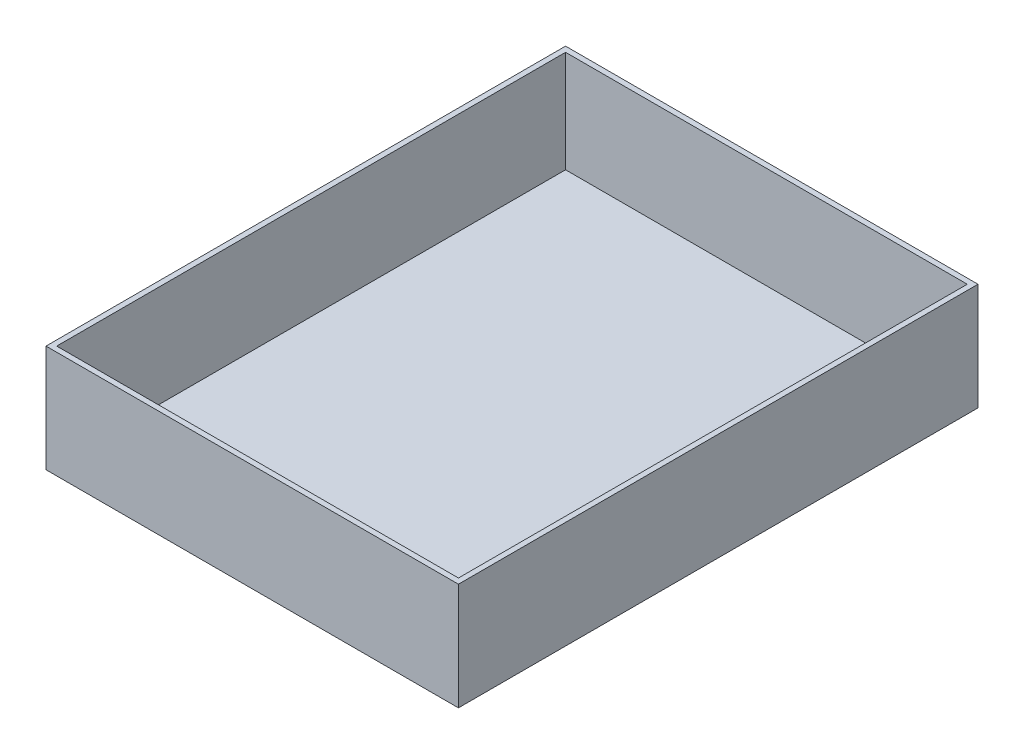
ISO-10303-21;
HEADER;
FILE_DESCRIPTION(('STEP AP214'),'2;1');
FILE_NAME('part.step','',(''),(''),'','','');
FILE_SCHEMA(('AUTOMOTIVE_DESIGN { 1 0 10303 214 1 1 1 1 }'));
ENDSEC;
DATA;
#1=APPLICATION_CONTEXT('core data for automotive mechanical design processes');
#2=APPLICATION_PROTOCOL_DEFINITION('international standard','automotive_design',2000,#1);
#3=PRODUCT_CONTEXT('',#1,'mechanical');
#4=PRODUCT('Part','Part','',(#3));
#5=PRODUCT_RELATED_PRODUCT_CATEGORY('part','',(#4));
#6=PRODUCT_DEFINITION_FORMATION('','',#4);
#7=PRODUCT_DEFINITION_CONTEXT('part definition',#1,'design');
#8=PRODUCT_DEFINITION('design','',#6,#7);
#9=PRODUCT_DEFINITION_SHAPE('','',#8);
#10=(LENGTH_UNIT() NAMED_UNIT(*) SI_UNIT(.MILLI.,.METRE.));
#11=(NAMED_UNIT(*) PLANE_ANGLE_UNIT() SI_UNIT($,.RADIAN.));
#12=(NAMED_UNIT(*) SI_UNIT($,.STERADIAN.) SOLID_ANGLE_UNIT());
#13=UNCERTAINTY_MEASURE_WITH_UNIT(LENGTH_MEASURE(1.E-05),#10,'distance_accuracy_value','');
#14=(GEOMETRIC_REPRESENTATION_CONTEXT(3) GLOBAL_UNCERTAINTY_ASSIGNED_CONTEXT((#13)) GLOBAL_UNIT_ASSIGNED_CONTEXT((#10,
#11,#12)) REPRESENTATION_CONTEXT('',''));
#15=CARTESIAN_POINT('',(0.,0.,0.));
#16=DIRECTION('',(0.,0.,1.));
#17=DIRECTION('',(1.,0.,0.));
#18=AXIS2_PLACEMENT_3D('',#15,#16,#17);
#19=CARTESIAN_POINT('',(0.,2.54,0.));
#20=DIRECTION('',(0.,1.,0.));
#21=DIRECTION('',(0.,0.,1.));
#22=AXIS2_PLACEMENT_3D('',#19,#20,#21);
#23=PLANE('',#22);
#24=DIRECTION('',(0.,0.,1.));
#25=VECTOR('',#24,1.);
#26=CARTESIAN_POINT('',(-95.25,2.54,-120.65));
#27=LINE('',#26,#25);
#28=CARTESIAN_POINT('',(-95.25,2.54,-120.65));
#29=VERTEX_POINT('',#28);
#30=CARTESIAN_POINT('',(-95.25,2.54,120.65));
#31=VERTEX_POINT('',#30);
#32=EDGE_CURVE('E110',#29,#31,#27,.T.);
#33=ORIENTED_EDGE('',*,*,#32,.T.);
#34=DIRECTION('',(1.,0.,0.));
#35=VECTOR('',#34,1.);
#36=CARTESIAN_POINT('',(-95.25,2.54,120.65));
#37=LINE('',#36,#35);
#38=CARTESIAN_POINT('',(95.25,2.54,120.65));
#39=VERTEX_POINT('',#38);
#40=EDGE_CURVE('E63',#31,#39,#37,.T.);
#41=ORIENTED_EDGE('',*,*,#40,.T.);
#42=DIRECTION('',(0.,0.,-1.));
#43=VECTOR('',#42,1.);
#44=CARTESIAN_POINT('',(95.25,2.54,-120.65));
#45=LINE('',#44,#43);
#46=CARTESIAN_POINT('',(95.2500000000001,2.54,-120.65));
#47=VERTEX_POINT('',#46);
#48=EDGE_CURVE('E48',#39,#47,#45,.T.);
#49=ORIENTED_EDGE('',*,*,#48,.T.);
#50=DIRECTION('',(-1.,0.,0.));
#51=VECTOR('',#50,1.);
#52=CARTESIAN_POINT('',(-95.25,2.54,-120.65));
#53=LINE('',#52,#51);
#54=EDGE_CURVE('E11',#47,#29,#53,.T.);
#55=ORIENTED_EDGE('',*,*,#54,.T.);
#56=EDGE_LOOP('',(#33,#41,#49,#55));
#57=FACE_BOUND('',#56,.T.);
#58=ADVANCED_FACE('F39',(#57),#23,.T.);
#59=CARTESIAN_POINT('',(-97.79,50.8,123.19));
#60=DIRECTION('',(-1.,0.,0.));
#61=DIRECTION('',(0.,0.,1.));
#62=AXIS2_PLACEMENT_3D('',#59,#60,#61);
#63=PLANE('',#62);
#64=DIRECTION('',(0.,0.,-1.));
#65=VECTOR('',#64,1.);
#66=CARTESIAN_POINT('',(-97.79,0.,123.19));
#67=LINE('',#66,#65);
#68=CARTESIAN_POINT('',(-97.79,0.,123.19));
#69=VERTEX_POINT('',#68);
#70=CARTESIAN_POINT('',(-97.79,0.,-123.19));
#71=VERTEX_POINT('',#70);
#72=EDGE_CURVE('E138',#69,#71,#67,.T.);
#73=ORIENTED_EDGE('',*,*,#72,.F.);
#74=DIRECTION('',(0.,-1.,0.));
#75=VECTOR('',#74,1.);
#76=CARTESIAN_POINT('',(-97.79,50.8,123.19));
#77=LINE('',#76,#75);
#78=CARTESIAN_POINT('',(-97.79,50.8,123.19));
#79=VERTEX_POINT('',#78);
#80=EDGE_CURVE('E176',#79,#69,#77,.T.);
#81=ORIENTED_EDGE('',*,*,#80,.F.);
#82=DIRECTION('',(0.,0.,-1.));
#83=VECTOR('',#82,1.);
#84=CARTESIAN_POINT('',(-97.79,50.8,123.19));
#85=LINE('',#84,#83);
#86=CARTESIAN_POINT('',(-97.79,50.8,-123.19));
#87=VERTEX_POINT('',#86);
#88=EDGE_CURVE('E144',#79,#87,#85,.T.);
#89=ORIENTED_EDGE('',*,*,#88,.T.);
#90=DIRECTION('',(0.,-1.,0.));
#91=VECTOR('',#90,1.);
#92=CARTESIAN_POINT('',(-97.79,50.8,-123.19));
#93=LINE('',#92,#91);
#94=EDGE_CURVE('E161',#87,#71,#93,.T.);
#95=ORIENTED_EDGE('',*,*,#94,.T.);
#96=EDGE_LOOP('',(#73,#81,#89,#95));
#97=FACE_BOUND('',#96,.T.);
#98=ADVANCED_FACE('F205',(#97),#63,.T.);
#99=CARTESIAN_POINT('',(-97.79,50.8,123.19));
#100=DIRECTION('',(0.,0.,1.));
#101=DIRECTION('',(1.,0.,0.));
#102=AXIS2_PLACEMENT_3D('',#99,#100,#101);
#103=PLANE('',#102);
#104=DIRECTION('',(-1.,0.,0.));
#105=VECTOR('',#104,1.);
#106=CARTESIAN_POINT('',(-97.79,0.,123.19));
#107=LINE('',#106,#105);
#108=CARTESIAN_POINT('',(97.79,0.,123.19));
#109=VERTEX_POINT('',#108);
#110=EDGE_CURVE('E149',#109,#69,#107,.T.);
#111=ORIENTED_EDGE('',*,*,#110,.F.);
#112=DIRECTION('',(0.,-1.,0.));
#113=VECTOR('',#112,1.);
#114=CARTESIAN_POINT('',(97.79,50.8,123.19));
#115=LINE('',#114,#113);
#116=CARTESIAN_POINT('',(97.79,50.8,123.19));
#117=VERTEX_POINT('',#116);
#118=EDGE_CURVE('E179',#117,#109,#115,.T.);
#119=ORIENTED_EDGE('',*,*,#118,.F.);
#120=DIRECTION('',(-1.,0.,0.));
#121=VECTOR('',#120,1.);
#122=CARTESIAN_POINT('',(-97.79,50.8,123.19));
#123=LINE('',#122,#121);
#124=EDGE_CURVE('E157',#117,#79,#123,.T.);
#125=ORIENTED_EDGE('',*,*,#124,.T.);
#126=ORIENTED_EDGE('',*,*,#80,.T.);
#127=EDGE_LOOP('',(#111,#119,#125,#126));
#128=FACE_BOUND('',#127,.T.);
#129=ADVANCED_FACE('F209',(#128),#103,.T.);
#130=CARTESIAN_POINT('',(97.79,50.8,123.19));
#131=DIRECTION('',(1.,0.,0.));
#132=DIRECTION('',(0.,0.,-1.));
#133=AXIS2_PLACEMENT_3D('',#130,#131,#132);
#134=PLANE('',#133);
#135=DIRECTION('',(0.,0.,1.));
#136=VECTOR('',#135,1.);
#137=CARTESIAN_POINT('',(97.79,0.,123.19));
#138=LINE('',#137,#136);
#139=CARTESIAN_POINT('',(97.79,0.,-123.19));
#140=VERTEX_POINT('',#139);
#141=EDGE_CURVE('E169',#140,#109,#138,.T.);
#142=ORIENTED_EDGE('',*,*,#141,.F.);
#143=DIRECTION('',(0.,-1.,0.));
#144=VECTOR('',#143,1.);
#145=CARTESIAN_POINT('',(97.79,50.8,-123.19));
#146=LINE('',#145,#144);
#147=CARTESIAN_POINT('',(97.79,50.8,-123.19));
#148=VERTEX_POINT('',#147);
#149=EDGE_CURVE('E182',#148,#140,#146,.T.);
#150=ORIENTED_EDGE('',*,*,#149,.F.);
#151=DIRECTION('',(0.,0.,1.));
#152=VECTOR('',#151,1.);
#153=CARTESIAN_POINT('',(97.79,50.8,123.19));
#154=LINE('',#153,#152);
#155=EDGE_CURVE('E153',#148,#117,#154,.T.);
#156=ORIENTED_EDGE('',*,*,#155,.T.);
#157=ORIENTED_EDGE('',*,*,#118,.T.);
#158=EDGE_LOOP('',(#142,#150,#156,#157));
#159=FACE_BOUND('',#158,.T.);
#160=ADVANCED_FACE('F216',(#159),#134,.T.);
#161=CARTESIAN_POINT('',(-97.79,50.8,-123.19));
#162=DIRECTION('',(0.,0.,-1.));
#163=DIRECTION('',(-1.,0.,0.));
#164=AXIS2_PLACEMENT_3D('',#161,#162,#163);
#165=PLANE('',#164);
#166=DIRECTION('',(1.,0.,0.));
#167=VECTOR('',#166,1.);
#168=CARTESIAN_POINT('',(-97.79,0.,-123.19));
#169=LINE('',#168,#167);
#170=EDGE_CURVE('E165',#71,#140,#169,.T.);
#171=ORIENTED_EDGE('',*,*,#170,.F.);
#172=ORIENTED_EDGE('',*,*,#94,.F.);
#173=DIRECTION('',(1.,0.,0.));
#174=VECTOR('',#173,1.);
#175=CARTESIAN_POINT('',(-97.79,50.8,-123.19));
#176=LINE('',#175,#174);
#177=EDGE_CURVE('E148',#87,#148,#176,.T.);
#178=ORIENTED_EDGE('',*,*,#177,.T.);
#179=ORIENTED_EDGE('',*,*,#149,.T.);
#180=EDGE_LOOP('',(#171,#172,#178,#179));
#181=FACE_BOUND('',#180,.T.);
#182=ADVANCED_FACE('F213',(#181),#165,.T.);
#183=CARTESIAN_POINT('',(0.,50.8,0.));
#184=DIRECTION('',(0.,-1.,0.));
#185=DIRECTION('',(0.,0.,-1.));
#186=AXIS2_PLACEMENT_3D('',#183,#184,#185);
#187=PLANE('',#186);
#188=DIRECTION('',(-1.,0.,0.));
#189=VECTOR('',#188,1.);
#190=CARTESIAN_POINT('',(-95.25,50.8,120.65));
#191=LINE('',#190,#189);
#192=CARTESIAN_POINT('',(95.25,50.8,120.65));
#193=VERTEX_POINT('',#192);
#194=CARTESIAN_POINT('',(-95.25,50.8,120.65));
#195=VERTEX_POINT('',#194);
#196=EDGE_CURVE('E113',#193,#195,#191,.T.);
#197=ORIENTED_EDGE('',*,*,#196,.T.);
#198=DIRECTION('',(0.,0.,-1.));
#199=VECTOR('',#198,1.);
#200=CARTESIAN_POINT('',(-95.25,50.8,120.65));
#201=LINE('',#200,#199);
#202=CARTESIAN_POINT('',(-95.25,50.8,-120.65));
#203=VERTEX_POINT('',#202);
#204=EDGE_CURVE('E107',#195,#203,#201,.T.);
#205=ORIENTED_EDGE('',*,*,#204,.T.);
#206=DIRECTION('',(1.,0.,0.));
#207=VECTOR('',#206,1.);
#208=CARTESIAN_POINT('',(-95.25,50.8,-120.65));
#209=LINE('',#208,#207);
#210=CARTESIAN_POINT('',(95.2500000000001,50.8,-120.65));
#211=VERTEX_POINT('',#210);
#212=EDGE_CURVE('E117',#203,#211,#209,.T.);
#213=ORIENTED_EDGE('',*,*,#212,.T.);
#214=DIRECTION('',(0.,0.,1.));
#215=VECTOR('',#214,1.);
#216=CARTESIAN_POINT('',(95.25,50.8,120.65));
#217=LINE('',#216,#215);
#218=EDGE_CURVE('E123',#211,#193,#217,.T.);
#219=ORIENTED_EDGE('',*,*,#218,.T.);
#220=EDGE_LOOP('',(#197,#205,#213,#219));
#221=FACE_BOUND('',#220,.T.);
#222=ORIENTED_EDGE('',*,*,#88,.F.);
#223=ORIENTED_EDGE('',*,*,#124,.F.);
#224=ORIENTED_EDGE('',*,*,#155,.F.);
#225=ORIENTED_EDGE('',*,*,#177,.F.);
#226=EDGE_LOOP('',(#222,#223,#224,#225));
#227=FACE_BOUND('',#226,.T.);
#228=ADVANCED_FACE('F125',(#221,#227),#187,.F.);
#229=CARTESIAN_POINT('',(-95.25,50.8,120.65));
#230=DIRECTION('',(-1.,0.,0.));
#231=DIRECTION('',(0.,0.,1.));
#232=AXIS2_PLACEMENT_3D('',#229,#230,#231);
#233=PLANE('',#232);
#234=ORIENTED_EDGE('',*,*,#32,.F.);
#235=DIRECTION('',(0.,-1.,0.));
#236=VECTOR('',#235,1.);
#237=CARTESIAN_POINT('',(-95.25,50.8,-120.65));
#238=LINE('',#237,#236);
#239=EDGE_CURVE('E55',#203,#29,#238,.T.);
#240=ORIENTED_EDGE('',*,*,#239,.F.);
#241=ORIENTED_EDGE('',*,*,#204,.F.);
#242=DIRECTION('',(0.,-1.,0.));
#243=VECTOR('',#242,1.);
#244=CARTESIAN_POINT('',(-95.25,50.8,120.65));
#245=LINE('',#244,#243);
#246=EDGE_CURVE('E135',#195,#31,#245,.T.);
#247=ORIENTED_EDGE('',*,*,#246,.T.);
#248=EDGE_LOOP('',(#234,#240,#241,#247));
#249=FACE_BOUND('',#248,.T.);
#250=ADVANCED_FACE('F105',(#249),#233,.F.);
#251=CARTESIAN_POINT('',(-95.25,50.8,120.65));
#252=DIRECTION('',(0.,0.,1.));
#253=DIRECTION('',(1.,0.,0.));
#254=AXIS2_PLACEMENT_3D('',#251,#252,#253);
#255=PLANE('',#254);
#256=ORIENTED_EDGE('',*,*,#40,.F.);
#257=ORIENTED_EDGE('',*,*,#246,.F.);
#258=ORIENTED_EDGE('',*,*,#196,.F.);
#259=DIRECTION('',(0.,-1.,0.));
#260=VECTOR('',#259,1.);
#261=CARTESIAN_POINT('',(95.25,50.8,120.65));
#262=LINE('',#261,#260);
#263=EDGE_CURVE('E139',#193,#39,#262,.T.);
#264=ORIENTED_EDGE('',*,*,#263,.T.);
#265=EDGE_LOOP('',(#256,#257,#258,#264));
#266=FACE_BOUND('',#265,.T.);
#267=ADVANCED_FACE('F195',(#266),#255,.F.);
#268=CARTESIAN_POINT('',(95.25,50.8,120.65));
#269=DIRECTION('',(1.,0.,0.));
#270=DIRECTION('',(0.,0.,-1.));
#271=AXIS2_PLACEMENT_3D('',#268,#269,#270);
#272=PLANE('',#271);
#273=ORIENTED_EDGE('',*,*,#48,.F.);
#274=ORIENTED_EDGE('',*,*,#263,.F.);
#275=ORIENTED_EDGE('',*,*,#218,.F.);
#276=DIRECTION('',(0.,-1.,0.));
#277=VECTOR('',#276,1.);
#278=CARTESIAN_POINT('',(95.2500000000001,50.8,-120.65));
#279=LINE('',#278,#277);
#280=EDGE_CURVE('E112',#211,#47,#279,.T.);
#281=ORIENTED_EDGE('',*,*,#280,.T.);
#282=EDGE_LOOP('',(#273,#274,#275,#281));
#283=FACE_BOUND('',#282,.T.);
#284=ADVANCED_FACE('F194',(#283),#272,.F.);
#285=CARTESIAN_POINT('',(-95.25,50.8,-120.65));
#286=DIRECTION('',(0.,0.,-1.));
#287=DIRECTION('',(-1.,0.,0.));
#288=AXIS2_PLACEMENT_3D('',#285,#286,#287);
#289=PLANE('',#288);
#290=ORIENTED_EDGE('',*,*,#54,.F.);
#291=ORIENTED_EDGE('',*,*,#280,.F.);
#292=ORIENTED_EDGE('',*,*,#212,.F.);
#293=ORIENTED_EDGE('',*,*,#239,.T.);
#294=EDGE_LOOP('',(#290,#291,#292,#293));
#295=FACE_BOUND('',#294,.T.);
#296=ADVANCED_FACE('F118',(#295),#289,.F.);
#297=CARTESIAN_POINT('',(0.,0.,0.));
#298=DIRECTION('',(0.,1.,0.));
#299=DIRECTION('',(0.,0.,1.));
#300=AXIS2_PLACEMENT_3D('',#297,#298,#299);
#301=PLANE('',#300);
#302=ORIENTED_EDGE('',*,*,#72,.T.);
#303=ORIENTED_EDGE('',*,*,#170,.T.);
#304=ORIENTED_EDGE('',*,*,#141,.T.);
#305=ORIENTED_EDGE('',*,*,#110,.T.);
#306=EDGE_LOOP('',(#302,#303,#304,#305));
#307=FACE_BOUND('',#306,.T.);
#308=ADVANCED_FACE('F41',(#307),#301,.F.);
#309=CLOSED_SHELL('',(#58,#98,#129,#160,#182,#228,#250,#267,#284,#296,#308));
#310=MANIFOLD_SOLID_BREP('B2',#309);
#311=ADVANCED_BREP_SHAPE_REPRESENTATION('',(#18,#310),#14);
#312=SHAPE_DEFINITION_REPRESENTATION(#9,#311);
ENDSEC;
END-ISO-10303-21;
